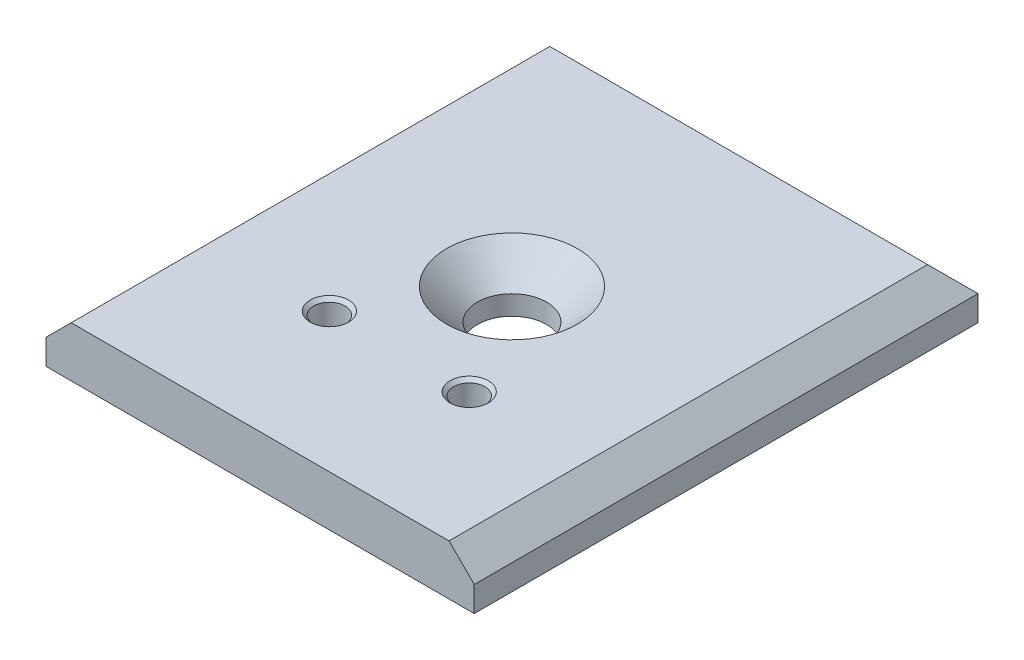
ISO-10303-21;
HEADER;
FILE_DESCRIPTION(('STEP AP214'),'2;1');
FILE_NAME('part.step','',(''),(''),'','','');
FILE_SCHEMA(('AUTOMOTIVE_DESIGN { 1 0 10303 214 1 1 1 1 }'));
ENDSEC;
DATA;
#1=APPLICATION_CONTEXT('core data for automotive mechanical design processes');
#2=APPLICATION_PROTOCOL_DEFINITION('international standard','automotive_design',2000,#1);
#3=PRODUCT_CONTEXT('',#1,'mechanical');
#4=PRODUCT('Part','Part','',(#3));
#5=PRODUCT_RELATED_PRODUCT_CATEGORY('part','',(#4));
#6=PRODUCT_DEFINITION_FORMATION('','',#4);
#7=PRODUCT_DEFINITION_CONTEXT('part definition',#1,'design');
#8=PRODUCT_DEFINITION('design','',#6,#7);
#9=PRODUCT_DEFINITION_SHAPE('','',#8);
#10=(LENGTH_UNIT() NAMED_UNIT(*) SI_UNIT(.MILLI.,.METRE.));
#11=(NAMED_UNIT(*) PLANE_ANGLE_UNIT() SI_UNIT($,.RADIAN.));
#12=(NAMED_UNIT(*) SI_UNIT($,.STERADIAN.) SOLID_ANGLE_UNIT());
#13=UNCERTAINTY_MEASURE_WITH_UNIT(LENGTH_MEASURE(1.E-05),#10,'distance_accuracy_value','');
#14=(GEOMETRIC_REPRESENTATION_CONTEXT(3) GLOBAL_UNCERTAINTY_ASSIGNED_CONTEXT((#13)) GLOBAL_UNIT_ASSIGNED_CONTEXT((#10,
#11,#12)) REPRESENTATION_CONTEXT('',''));
#15=CARTESIAN_POINT('',(0.,0.,0.));
#16=DIRECTION('',(0.,0.,1.));
#17=DIRECTION('',(1.,0.,0.));
#18=AXIS2_PLACEMENT_3D('',#15,#16,#17);
#19=CARTESIAN_POINT('',(17.,4.,-20.));
#20=DIRECTION('',(-1.,0.,0.));
#21=DIRECTION('',(0.,0.,1.));
#22=AXIS2_PLACEMENT_3D('',#19,#20,#21);
#23=PLANE('',#22);
#24=DIRECTION('',(0.,-1.,0.));
#25=VECTOR('',#24,1.);
#26=CARTESIAN_POINT('',(17.,4.,-20.));
#27=LINE('',#26,#25);
#28=CARTESIAN_POINT('',(17.,1.99999999999998,-20.));
#29=VERTEX_POINT('',#28);
#30=CARTESIAN_POINT('',(17.,0.,-20.));
#31=VERTEX_POINT('',#30);
#32=EDGE_CURVE('E88',#29,#31,#27,.T.);
#33=ORIENTED_EDGE('',*,*,#32,.F.);
#34=DIRECTION('',(0.,0.,1.));
#35=VECTOR('',#34,1.);
#36=CARTESIAN_POINT('',(17.,1.99999999999998,20.));
#37=LINE('',#36,#35);
#38=CARTESIAN_POINT('',(17.,1.99999999999998,20.));
#39=VERTEX_POINT('',#38);
#40=EDGE_CURVE('E132',#29,#39,#37,.T.);
#41=ORIENTED_EDGE('',*,*,#40,.T.);
#42=DIRECTION('',(0.,-1.,0.));
#43=VECTOR('',#42,1.);
#44=CARTESIAN_POINT('',(17.,4.,20.));
#45=LINE('',#44,#43);
#46=CARTESIAN_POINT('',(17.,0.,20.));
#47=VERTEX_POINT('',#46);
#48=EDGE_CURVE('E109',#39,#47,#45,.T.);
#49=ORIENTED_EDGE('',*,*,#48,.T.);
#50=DIRECTION('',(0.,0.,-1.));
#51=VECTOR('',#50,1.);
#52=CARTESIAN_POINT('',(17.,0.,-20.));
#53=LINE('',#52,#51);
#54=EDGE_CURVE('E104',#47,#31,#53,.T.);
#55=ORIENTED_EDGE('',*,*,#54,.T.);
#56=EDGE_LOOP('',(#33,#41,#49,#55));
#57=FACE_BOUND('',#56,.T.);
#58=ADVANCED_FACE('F34',(#57),#23,.F.);
#59=CARTESIAN_POINT('',(-17.,4.,-20.));
#60=DIRECTION('',(0.,0.,1.));
#61=DIRECTION('',(1.,0.,0.));
#62=AXIS2_PLACEMENT_3D('',#59,#60,#61);
#63=PLANE('',#62);
#64=DIRECTION('',(0.,-1.,0.));
#65=VECTOR('',#64,1.);
#66=CARTESIAN_POINT('',(-17.,4.,-20.));
#67=LINE('',#66,#65);
#68=CARTESIAN_POINT('',(-17.,1.99999999999998,-20.));
#69=VERTEX_POINT('',#68);
#70=CARTESIAN_POINT('',(-17.,0.,-20.));
#71=VERTEX_POINT('',#70);
#72=EDGE_CURVE('E98',#69,#71,#67,.T.);
#73=ORIENTED_EDGE('',*,*,#72,.F.);
#74=DIRECTION('',(1.,0.,0.));
#75=VECTOR('',#74,1.);
#76=CARTESIAN_POINT('',(17.,1.99999999999998,-20.));
#77=LINE('',#76,#75);
#78=EDGE_CURVE('E43',#69,#29,#77,.T.);
#79=ORIENTED_EDGE('',*,*,#78,.T.);
#80=ORIENTED_EDGE('',*,*,#32,.T.);
#81=DIRECTION('',(-1.,0.,0.));
#82=VECTOR('',#81,1.);
#83=CARTESIAN_POINT('',(-17.,0.,-20.));
#84=LINE('',#83,#82);
#85=EDGE_CURVE('E91',#31,#71,#84,.T.);
#86=ORIENTED_EDGE('',*,*,#85,.T.);
#87=EDGE_LOOP('',(#73,#79,#80,#86));
#88=FACE_BOUND('',#87,.T.);
#89=ADVANCED_FACE('F90',(#88),#63,.F.);
#90=CARTESIAN_POINT('',(-17.,4.,-20.));
#91=DIRECTION('',(1.,0.,0.));
#92=DIRECTION('',(0.,0.,-1.));
#93=AXIS2_PLACEMENT_3D('',#90,#91,#92);
#94=PLANE('',#93);
#95=DIRECTION('',(0.,-1.,0.));
#96=VECTOR('',#95,1.);
#97=CARTESIAN_POINT('',(-17.,4.,20.));
#98=LINE('',#97,#96);
#99=CARTESIAN_POINT('',(-17.,1.99999999999998,20.));
#100=VERTEX_POINT('',#99);
#101=CARTESIAN_POINT('',(-17.,0.,20.));
#102=VERTEX_POINT('',#101);
#103=EDGE_CURVE('E123',#100,#102,#98,.T.);
#104=ORIENTED_EDGE('',*,*,#103,.F.);
#105=DIRECTION('',(0.,0.,-1.));
#106=VECTOR('',#105,1.);
#107=CARTESIAN_POINT('',(-17.,1.99999999999998,-20.));
#108=LINE('',#107,#106);
#109=EDGE_CURVE('E11',#100,#69,#108,.T.);
#110=ORIENTED_EDGE('',*,*,#109,.T.);
#111=ORIENTED_EDGE('',*,*,#72,.T.);
#112=DIRECTION('',(0.,0.,1.));
#113=VECTOR('',#112,1.);
#114=CARTESIAN_POINT('',(-17.,0.,-20.));
#115=LINE('',#114,#113);
#116=EDGE_CURVE('E106',#71,#102,#115,.T.);
#117=ORIENTED_EDGE('',*,*,#116,.T.);
#118=EDGE_LOOP('',(#104,#110,#111,#117));
#119=FACE_BOUND('',#118,.T.);
#120=ADVANCED_FACE('F191',(#119),#94,.F.);
#121=CARTESIAN_POINT('',(-17.,4.,20.));
#122=DIRECTION('',(0.,0.,-1.));
#123=DIRECTION('',(-1.,0.,0.));
#124=AXIS2_PLACEMENT_3D('',#121,#122,#123);
#125=PLANE('',#124);
#126=ORIENTED_EDGE('',*,*,#48,.F.);
#127=DIRECTION('',(-0.707106781186545,0.70710678118655,0.));
#128=VECTOR('',#127,1.);
#129=CARTESIAN_POINT('',(15.,4.,20.));
#130=LINE('',#129,#128);
#131=CARTESIAN_POINT('',(15.,4.,20.));
#132=VERTEX_POINT('',#131);
#133=EDGE_CURVE('E135',#39,#132,#130,.T.);
#134=ORIENTED_EDGE('',*,*,#133,.T.);
#135=DIRECTION('',(1.,0.,0.));
#136=VECTOR('',#135,1.);
#137=CARTESIAN_POINT('',(-17.,4.,20.));
#138=LINE('',#137,#136);
#139=CARTESIAN_POINT('',(-15.,4.,20.));
#140=VERTEX_POINT('',#139);
#141=EDGE_CURVE('E117',#140,#132,#138,.T.);
#142=ORIENTED_EDGE('',*,*,#141,.F.);
#143=DIRECTION('',(-0.707106781186545,-0.70710678118655,0.));
#144=VECTOR('',#143,1.);
#145=CARTESIAN_POINT('',(-15.,4.,20.));
#146=LINE('',#145,#144);
#147=EDGE_CURVE('E57',#140,#100,#146,.T.);
#148=ORIENTED_EDGE('',*,*,#147,.T.);
#149=ORIENTED_EDGE('',*,*,#103,.T.);
#150=DIRECTION('',(1.,0.,0.));
#151=VECTOR('',#150,1.);
#152=CARTESIAN_POINT('',(-17.,0.,20.));
#153=LINE('',#152,#151);
#154=EDGE_CURVE('E120',#102,#47,#153,.T.);
#155=ORIENTED_EDGE('',*,*,#154,.T.);
#156=EDGE_LOOP('',(#126,#134,#142,#148,#149,#155));
#157=FACE_BOUND('',#156,.T.);
#158=ADVANCED_FACE('F184',(#157),#125,.F.);
#159=CARTESIAN_POINT('',(0.,4.,0.));
#160=DIRECTION('',(0.,1.,0.));
#161=DIRECTION('',(0.,0.,1.));
#162=AXIS2_PLACEMENT_3D('',#159,#160,#161);
#163=PLANE('',#162);
#164=CARTESIAN_POINT('',(-5.54999999999931,4.,8.94999999999997));
#165=DIRECTION('',(0.,1.,0.));
#166=DIRECTION('',(0.,0.,1.));
#167=AXIS2_PLACEMENT_3D('',#164,#165,#166);
#168=CIRCLE('',#167,1.525);
#169=CARTESIAN_POINT('',(-5.54999999999931,4.,10.475));
#170=VERTEX_POINT('',#169);
#171=EDGE_CURVE('E143',#170,#170,#168,.T.);
#172=ORIENTED_EDGE('',*,*,#171,.F.);
#173=EDGE_LOOP('',(#172));
#174=FACE_BOUND('',#173,.T.);
#175=CARTESIAN_POINT('',(5.54999999999931,4.,8.94999999999997));
#176=DIRECTION('',(0.,1.,0.));
#177=DIRECTION('',(0.,0.,1.));
#178=AXIS2_PLACEMENT_3D('',#175,#176,#177);
#179=CIRCLE('',#178,1.525);
#180=CARTESIAN_POINT('',(5.54999999999931,4.,10.475));
#181=VERTEX_POINT('',#180);
#182=EDGE_CURVE('E157',#181,#181,#179,.T.);
#183=ORIENTED_EDGE('',*,*,#182,.F.);
#184=EDGE_LOOP('',(#183));
#185=FACE_BOUND('',#184,.T.);
#186=CARTESIAN_POINT('',(0.,4.,0.));
#187=DIRECTION('',(0.,1.,0.));
#188=DIRECTION('',(0.,0.,1.));
#189=AXIS2_PLACEMENT_3D('',#186,#187,#188);
#190=CIRCLE('',#189,5.2);
#191=CARTESIAN_POINT('',(0.,4.,5.2));
#192=VERTEX_POINT('',#191);
#193=EDGE_CURVE('E166',#192,#192,#190,.T.);
#194=ORIENTED_EDGE('',*,*,#193,.F.);
#195=EDGE_LOOP('',(#194));
#196=FACE_BOUND('',#195,.T.);
#197=ORIENTED_EDGE('',*,*,#141,.T.);
#198=DIRECTION('',(0.,0.,-1.));
#199=VECTOR('',#198,1.);
#200=CARTESIAN_POINT('',(15.,4.,-20.));
#201=LINE('',#200,#199);
#202=CARTESIAN_POINT('',(15.,4.,-18.));
#203=VERTEX_POINT('',#202);
#204=EDGE_CURVE('E129',#132,#203,#201,.T.);
#205=ORIENTED_EDGE('',*,*,#204,.T.);
#206=DIRECTION('',(-1.,0.,0.));
#207=VECTOR('',#206,1.);
#208=CARTESIAN_POINT('',(-17.,4.,-18.));
#209=LINE('',#208,#207);
#210=CARTESIAN_POINT('',(-15.,4.,-18.));
#211=VERTEX_POINT('',#210);
#212=EDGE_CURVE('E127',#203,#211,#209,.T.);
#213=ORIENTED_EDGE('',*,*,#212,.T.);
#214=DIRECTION('',(0.,0.,1.));
#215=VECTOR('',#214,1.);
#216=CARTESIAN_POINT('',(-15.,4.,20.));
#217=LINE('',#216,#215);
#218=EDGE_CURVE('E97',#211,#140,#217,.T.);
#219=ORIENTED_EDGE('',*,*,#218,.T.);
#220=EDGE_LOOP('',(#197,#205,#213,#219));
#221=FACE_BOUND('',#220,.T.);
#222=ADVANCED_FACE('F181',(#174,#185,#196,#221),#163,.T.);
#223=CARTESIAN_POINT('',(0.,0.,0.));
#224=DIRECTION('',(0.,1.,0.));
#225=DIRECTION('',(0.,0.,1.));
#226=AXIS2_PLACEMENT_3D('',#223,#224,#225);
#227=PLANE('',#226);
#228=CARTESIAN_POINT('',(-5.54999999999931,0.,8.94999999999997));
#229=DIRECTION('',(0.,1.,0.));
#230=DIRECTION('',(0.,0.,1.));
#231=AXIS2_PLACEMENT_3D('',#228,#229,#230);
#232=CIRCLE('',#231,1.25);
#233=CARTESIAN_POINT('',(-5.54999999999931,0.,10.2));
#234=VERTEX_POINT('',#233);
#235=EDGE_CURVE('E152',#234,#234,#232,.T.);
#236=ORIENTED_EDGE('',*,*,#235,.T.);
#237=EDGE_LOOP('',(#236));
#238=FACE_BOUND('',#237,.T.);
#239=CARTESIAN_POINT('',(5.54999999999931,0.,8.94999999999997));
#240=DIRECTION('',(0.,1.,0.));
#241=DIRECTION('',(0.,0.,1.));
#242=AXIS2_PLACEMENT_3D('',#239,#240,#241);
#243=CIRCLE('',#242,1.25);
#244=CARTESIAN_POINT('',(5.54999999999931,0.,10.2));
#245=VERTEX_POINT('',#244);
#246=EDGE_CURVE('E163',#245,#245,#243,.T.);
#247=ORIENTED_EDGE('',*,*,#246,.T.);
#248=EDGE_LOOP('',(#247));
#249=FACE_BOUND('',#248,.T.);
#250=CARTESIAN_POINT('',(0.,0.,0.));
#251=DIRECTION('',(0.,1.,0.));
#252=DIRECTION('',(0.,0.,1.));
#253=AXIS2_PLACEMENT_3D('',#250,#251,#252);
#254=CIRCLE('',#253,2.75);
#255=CARTESIAN_POINT('',(0.,0.,2.75));
#256=VERTEX_POINT('',#255);
#257=EDGE_CURVE('E111',#256,#256,#254,.T.);
#258=ORIENTED_EDGE('',*,*,#257,.T.);
#259=EDGE_LOOP('',(#258));
#260=FACE_BOUND('',#259,.T.);
#261=ORIENTED_EDGE('',*,*,#54,.F.);
#262=ORIENTED_EDGE('',*,*,#154,.F.);
#263=ORIENTED_EDGE('',*,*,#116,.F.);
#264=ORIENTED_EDGE('',*,*,#85,.F.);
#265=EDGE_LOOP('',(#261,#262,#263,#264));
#266=FACE_BOUND('',#265,.T.);
#267=ADVANCED_FACE('F102',(#238,#249,#260,#266),#227,.F.);
#268=CARTESIAN_POINT('',(0.,4.,0.));
#269=DIRECTION('',(0.,1.,0.));
#270=DIRECTION('',(0.,0.,1.));
#271=AXIS2_PLACEMENT_3D('',#268,#269,#270);
#272=CYLINDRICAL_SURFACE('',#271,2.74999999999999);
#273=ORIENTED_EDGE('',*,*,#257,.F.);
#274=EDGE_LOOP('',(#273));
#275=FACE_BOUND('',#274,.T.);
#276=CARTESIAN_POINT('',(0.,1.54999999999999,0.));
#277=DIRECTION('',(0.,1.,0.));
#278=DIRECTION('',(0.,0.,1.));
#279=AXIS2_PLACEMENT_3D('',#276,#277,#278);
#280=CIRCLE('',#279,2.74999999999999);
#281=CARTESIAN_POINT('',(0.,1.54999999999999,2.74999999999999));
#282=VERTEX_POINT('',#281);
#283=EDGE_CURVE('E114',#282,#282,#280,.T.);
#284=ORIENTED_EDGE('',*,*,#283,.T.);
#285=EDGE_LOOP('',(#284));
#286=FACE_BOUND('',#285,.T.);
#287=ADVANCED_FACE('F172',(#275,#286),#272,.F.);
#288=CARTESIAN_POINT('',(0.,4.,0.));
#289=DIRECTION('',(0.,1.,0.));
#290=DIRECTION('',(0.,0.,1.));
#291=AXIS2_PLACEMENT_3D('',#288,#289,#290);
#292=CONICAL_SURFACE('',#291,5.2,0.785398163397449);
#293=ORIENTED_EDGE('',*,*,#283,.F.);
#294=EDGE_LOOP('',(#293));
#295=FACE_BOUND('',#294,.T.);
#296=ORIENTED_EDGE('',*,*,#193,.T.);
#297=EDGE_LOOP('',(#296));
#298=FACE_BOUND('',#297,.T.);
#299=ADVANCED_FACE('F174',(#295,#298),#292,.F.);
#300=CARTESIAN_POINT('',(5.54999999999931,4.,8.94999999999997));
#301=DIRECTION('',(0.,1.,0.));
#302=DIRECTION('',(0.,0.,1.));
#303=AXIS2_PLACEMENT_3D('',#300,#301,#302);
#304=CYLINDRICAL_SURFACE('',#303,1.25);
#305=ORIENTED_EDGE('',*,*,#246,.F.);
#306=EDGE_LOOP('',(#305));
#307=FACE_BOUND('',#306,.T.);
#308=CARTESIAN_POINT('',(5.54999999999931,3.725,8.94999999999997));
#309=DIRECTION('',(0.,1.,0.));
#310=DIRECTION('',(0.,0.,1.));
#311=AXIS2_PLACEMENT_3D('',#308,#309,#310);
#312=CIRCLE('',#311,1.25);
#313=CARTESIAN_POINT('',(5.54999999999931,3.725,10.2));
#314=VERTEX_POINT('',#313);
#315=EDGE_CURVE('E160',#314,#314,#312,.T.);
#316=ORIENTED_EDGE('',*,*,#315,.T.);
#317=EDGE_LOOP('',(#316));
#318=FACE_BOUND('',#317,.T.);
#319=ADVANCED_FACE('F177',(#307,#318),#304,.F.);
#320=CARTESIAN_POINT('',(5.54999999999931,4.,8.94999999999997));
#321=DIRECTION('',(0.,1.,0.));
#322=DIRECTION('',(0.,0.,1.));
#323=AXIS2_PLACEMENT_3D('',#320,#321,#322);
#324=CONICAL_SURFACE('',#323,1.525,0.785398163397452);
#325=ORIENTED_EDGE('',*,*,#315,.F.);
#326=EDGE_LOOP('',(#325));
#327=FACE_BOUND('',#326,.T.);
#328=ORIENTED_EDGE('',*,*,#182,.T.);
#329=EDGE_LOOP('',(#328));
#330=FACE_BOUND('',#329,.T.);
#331=ADVANCED_FACE('F220',(#327,#330),#324,.F.);
#332=CARTESIAN_POINT('',(-5.54999999999931,4.,8.94999999999997));
#333=DIRECTION('',(0.,1.,0.));
#334=DIRECTION('',(0.,0.,1.));
#335=AXIS2_PLACEMENT_3D('',#332,#333,#334);
#336=CYLINDRICAL_SURFACE('',#335,1.25);
#337=ORIENTED_EDGE('',*,*,#235,.F.);
#338=EDGE_LOOP('',(#337));
#339=FACE_BOUND('',#338,.T.);
#340=CARTESIAN_POINT('',(-5.54999999999931,3.725,8.94999999999997));
#341=DIRECTION('',(0.,1.,0.));
#342=DIRECTION('',(0.,0.,1.));
#343=AXIS2_PLACEMENT_3D('',#340,#341,#342);
#344=CIRCLE('',#343,1.25);
#345=CARTESIAN_POINT('',(-5.54999999999931,3.725,10.2));
#346=VERTEX_POINT('',#345);
#347=EDGE_CURVE('E147',#346,#346,#344,.T.);
#348=ORIENTED_EDGE('',*,*,#347,.T.);
#349=EDGE_LOOP('',(#348));
#350=FACE_BOUND('',#349,.T.);
#351=ADVANCED_FACE('F224',(#339,#350),#336,.F.);
#352=CARTESIAN_POINT('',(-5.54999999999931,4.,8.94999999999997));
#353=DIRECTION('',(0.,1.,0.));
#354=DIRECTION('',(0.,0.,1.));
#355=AXIS2_PLACEMENT_3D('',#352,#353,#354);
#356=CONICAL_SURFACE('',#355,1.525,0.785398163397452);
#357=ORIENTED_EDGE('',*,*,#347,.F.);
#358=EDGE_LOOP('',(#357));
#359=FACE_BOUND('',#358,.T.);
#360=ORIENTED_EDGE('',*,*,#171,.T.);
#361=EDGE_LOOP('',(#360));
#362=FACE_BOUND('',#361,.T.);
#363=ADVANCED_FACE('F200',(#359,#362),#356,.F.);
#364=CARTESIAN_POINT('',(-15.,4.,0.));
#365=DIRECTION('',(-0.70710678118655,0.707106781186545,0.));
#366=DIRECTION('',(0.,0.,-1.));
#367=AXIS2_PLACEMENT_3D('',#364,#365,#366);
#368=PLANE('',#367);
#369=ORIENTED_EDGE('',*,*,#147,.F.);
#370=ORIENTED_EDGE('',*,*,#218,.F.);
#371=DIRECTION('',(-0.577350269189625,-0.577350269189628,-0.577350269189624));
#372=VECTOR('',#371,1.);
#373=CARTESIAN_POINT('',(-9.00000000000003,10.,-12.));
#374=LINE('',#373,#372);
#375=EDGE_CURVE('E38',#69,#211,#374,.F.);
#376=ORIENTED_EDGE('',*,*,#375,.F.);
#377=ORIENTED_EDGE('',*,*,#109,.F.);
#378=EDGE_LOOP('',(#369,#370,#376,#377));
#379=FACE_BOUND('',#378,.T.);
#380=ADVANCED_FACE('F36',(#379),#368,.T.);
#381=CARTESIAN_POINT('',(0.,4.,-18.));
#382=DIRECTION('',(0.,0.707106781186545,-0.70710678118655));
#383=DIRECTION('',(1.,0.,0.));
#384=AXIS2_PLACEMENT_3D('',#381,#382,#383);
#385=PLANE('',#384);
#386=ORIENTED_EDGE('',*,*,#375,.T.);
#387=ORIENTED_EDGE('',*,*,#212,.F.);
#388=DIRECTION('',(0.577350269189624,-0.577350269189628,-0.577350269189624));
#389=VECTOR('',#388,1.);
#390=CARTESIAN_POINT('',(10.,9.00000000000001,-13.));
#391=LINE('',#390,#389);
#392=EDGE_CURVE('E137',#29,#203,#391,.F.);
#393=ORIENTED_EDGE('',*,*,#392,.F.);
#394=ORIENTED_EDGE('',*,*,#78,.F.);
#395=EDGE_LOOP('',(#386,#387,#393,#394));
#396=FACE_BOUND('',#395,.T.);
#397=ADVANCED_FACE('F193',(#396),#385,.T.);
#398=CARTESIAN_POINT('',(15.,4.,0.));
#399=DIRECTION('',(0.70710678118655,0.707106781186545,0.));
#400=DIRECTION('',(0.,0.,1.));
#401=AXIS2_PLACEMENT_3D('',#398,#399,#400);
#402=PLANE('',#401);
#403=ORIENTED_EDGE('',*,*,#133,.F.);
#404=ORIENTED_EDGE('',*,*,#40,.F.);
#405=ORIENTED_EDGE('',*,*,#392,.T.);
#406=ORIENTED_EDGE('',*,*,#204,.F.);
#407=EDGE_LOOP('',(#403,#404,#405,#406));
#408=FACE_BOUND('',#407,.T.);
#409=ADVANCED_FACE('F190',(#408),#402,.T.);
#410=CLOSED_SHELL('',(#58,#89,#120,#158,#222,#267,#287,#299,#319,#331,#351,#363,#380,#397,#409));
#411=MANIFOLD_SOLID_BREP('B2',#410);
#412=ADVANCED_BREP_SHAPE_REPRESENTATION('',(#18,#411),#14);
#413=SHAPE_DEFINITION_REPRESENTATION(#9,#412);
ENDSEC;
END-ISO-10303-21;
